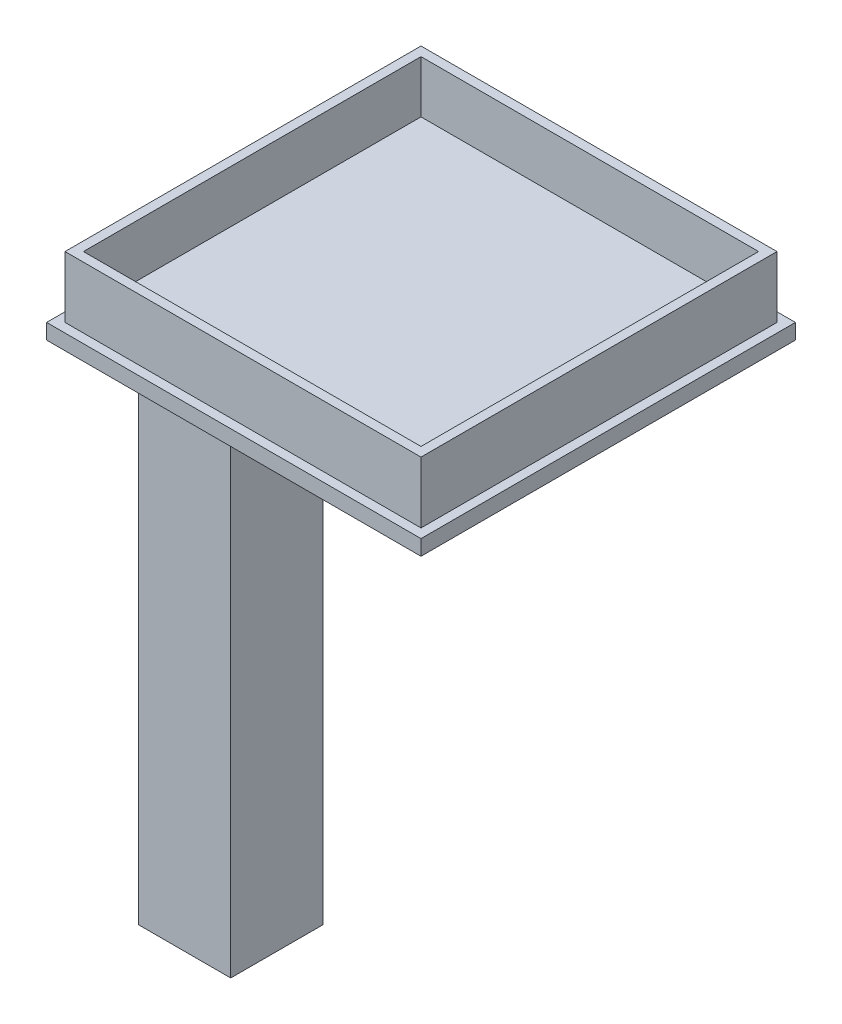
ISO-10303-21;
HEADER;
FILE_DESCRIPTION(('STEP AP214'),'2;1');
FILE_NAME('part.step','',(''),(''),'','','');
FILE_SCHEMA(('AUTOMOTIVE_DESIGN { 1 0 10303 214 1 1 1 1 }'));
ENDSEC;
DATA;
#1=APPLICATION_CONTEXT('core data for automotive mechanical design processes');
#2=APPLICATION_PROTOCOL_DEFINITION('international standard','automotive_design',2000,#1);
#3=PRODUCT_CONTEXT('',#1,'mechanical');
#4=PRODUCT('Part','Part','',(#3));
#5=PRODUCT_RELATED_PRODUCT_CATEGORY('part','',(#4));
#6=PRODUCT_DEFINITION_FORMATION('','',#4);
#7=PRODUCT_DEFINITION_CONTEXT('part definition',#1,'design');
#8=PRODUCT_DEFINITION('design','',#6,#7);
#9=PRODUCT_DEFINITION_SHAPE('','',#8);
#10=(LENGTH_UNIT() NAMED_UNIT(*) SI_UNIT(.MILLI.,.METRE.));
#11=(NAMED_UNIT(*) PLANE_ANGLE_UNIT() SI_UNIT($,.RADIAN.));
#12=(NAMED_UNIT(*) SI_UNIT($,.STERADIAN.) SOLID_ANGLE_UNIT());
#13=UNCERTAINTY_MEASURE_WITH_UNIT(LENGTH_MEASURE(1.E-05),#10,'distance_accuracy_value','');
#14=(GEOMETRIC_REPRESENTATION_CONTEXT(3) GLOBAL_UNCERTAINTY_ASSIGNED_CONTEXT((#13)) GLOBAL_UNIT_ASSIGNED_CONTEXT((#10,
#11,#12)) REPRESENTATION_CONTEXT('',''));
#15=CARTESIAN_POINT('',(0.,0.,0.));
#16=DIRECTION('',(0.,0.,1.));
#17=DIRECTION('',(1.,0.,0.));
#18=AXIS2_PLACEMENT_3D('',#15,#16,#17);
#19=CARTESIAN_POINT('',(0.,-5.,0.));
#20=DIRECTION('',(0.,-1.,0.));
#21=DIRECTION('',(0.,0.,-1.));
#22=AXIS2_PLACEMENT_3D('',#19,#20,#21);
#23=PLANE('',#22);
#24=DIRECTION('',(-1.,0.,0.));
#25=VECTOR('',#24,1.);
#26=CARTESIAN_POINT('',(61.,-5.,61.));
#27=LINE('',#26,#25);
#28=CARTESIAN_POINT('',(61.,-5.,61.));
#29=VERTEX_POINT('',#28);
#30=CARTESIAN_POINT('',(-61.,-5.,61.));
#31=VERTEX_POINT('',#30);
#32=EDGE_CURVE('E240',#29,#31,#27,.T.);
#33=ORIENTED_EDGE('',*,*,#32,.T.);
#34=DIRECTION('',(0.,0.,-1.));
#35=VECTOR('',#34,1.);
#36=CARTESIAN_POINT('',(-61.,-5.,61.));
#37=LINE('',#36,#35);
#38=CARTESIAN_POINT('',(-61.,-5.,-61.));
#39=VERTEX_POINT('',#38);
#40=EDGE_CURVE('E243',#31,#39,#37,.T.);
#41=ORIENTED_EDGE('',*,*,#40,.T.);
#42=DIRECTION('',(1.,0.,0.));
#43=VECTOR('',#42,1.);
#44=CARTESIAN_POINT('',(-61.,-5.,-61.));
#45=LINE('',#44,#43);
#46=CARTESIAN_POINT('',(61.,-5.,-61.));
#47=VERTEX_POINT('',#46);
#48=EDGE_CURVE('E246',#39,#47,#45,.T.);
#49=ORIENTED_EDGE('',*,*,#48,.T.);
#50=DIRECTION('',(0.,0.,1.));
#51=VECTOR('',#50,1.);
#52=CARTESIAN_POINT('',(61.,-5.,-61.));
#53=LINE('',#52,#51);
#54=EDGE_CURVE('E248',#47,#29,#53,.T.);
#55=ORIENTED_EDGE('',*,*,#54,.T.);
#56=EDGE_LOOP('',(#33,#41,#49,#55));
#57=FACE_BOUND('',#56,.T.);
#58=DIRECTION('',(1.,0.,0.));
#59=VECTOR('',#58,1.);
#60=CARTESIAN_POINT('',(-46.,-5.,16.));
#61=LINE('',#60,#59);
#62=CARTESIAN_POINT('',(-46.,-5.,16.));
#63=VERTEX_POINT('',#62);
#64=CARTESIAN_POINT('',(-16.,-5.,16.));
#65=VERTEX_POINT('',#64);
#66=EDGE_CURVE('E226',#63,#65,#61,.T.);
#67=ORIENTED_EDGE('',*,*,#66,.F.);
#68=DIRECTION('',(0.,0.,-1.));
#69=VECTOR('',#68,1.);
#70=CARTESIAN_POINT('',(-46.,-5.,46.));
#71=LINE('',#70,#69);
#72=CARTESIAN_POINT('',(-46.,-5.,46.));
#73=VERTEX_POINT('',#72);
#74=EDGE_CURVE('E191',#73,#63,#71,.T.);
#75=ORIENTED_EDGE('',*,*,#74,.F.);
#76=DIRECTION('',(-1.,0.,0.));
#77=VECTOR('',#76,1.);
#78=CARTESIAN_POINT('',(-46.,-5.,46.));
#79=LINE('',#78,#77);
#80=CARTESIAN_POINT('',(-16.,-5.,46.));
#81=VERTEX_POINT('',#80);
#82=EDGE_CURVE('E217',#81,#73,#79,.T.);
#83=ORIENTED_EDGE('',*,*,#82,.F.);
#84=DIRECTION('',(0.,0.,1.));
#85=VECTOR('',#84,1.);
#86=CARTESIAN_POINT('',(-16.,-5.,46.));
#87=LINE('',#86,#85);
#88=EDGE_CURVE('E228',#65,#81,#87,.T.);
#89=ORIENTED_EDGE('',*,*,#88,.F.);
#90=EDGE_LOOP('',(#67,#75,#83,#89));
#91=FACE_BOUND('',#90,.T.);
#92=ADVANCED_FACE('F35',(#57,#91),#23,.T.);
#93=CARTESIAN_POINT('',(-58.,20.,-58.));
#94=DIRECTION('',(1.,0.,0.));
#95=DIRECTION('',(0.,0.,-1.));
#96=AXIS2_PLACEMENT_3D('',#93,#94,#95);
#97=PLANE('',#96);
#98=DIRECTION('',(0.,0.,1.));
#99=VECTOR('',#98,1.);
#100=CARTESIAN_POINT('',(-58.,0.,-58.));
#101=LINE('',#100,#99);
#102=CARTESIAN_POINT('',(-58.,0.,-58.));
#103=VERTEX_POINT('',#102);
#104=CARTESIAN_POINT('',(-58.,0.,58.));
#105=VERTEX_POINT('',#104);
#106=EDGE_CURVE('E276',#103,#105,#101,.T.);
#107=ORIENTED_EDGE('',*,*,#106,.T.);
#108=DIRECTION('',(0.,-1.,0.));
#109=VECTOR('',#108,1.);
#110=CARTESIAN_POINT('',(-58.,20.,58.));
#111=LINE('',#110,#109);
#112=CARTESIAN_POINT('',(-58.,20.,58.));
#113=VERTEX_POINT('',#112);
#114=EDGE_CURVE('E11',#113,#105,#111,.T.);
#115=ORIENTED_EDGE('',*,*,#114,.F.);
#116=DIRECTION('',(0.,0.,1.));
#117=VECTOR('',#116,1.);
#118=CARTESIAN_POINT('',(-58.,20.,-58.));
#119=LINE('',#118,#117);
#120=CARTESIAN_POINT('',(-58.,20.,-58.));
#121=VERTEX_POINT('',#120);
#122=EDGE_CURVE('E300',#121,#113,#119,.T.);
#123=ORIENTED_EDGE('',*,*,#122,.F.);
#124=DIRECTION('',(0.,-1.,0.));
#125=VECTOR('',#124,1.);
#126=CARTESIAN_POINT('',(-58.,20.,-58.));
#127=LINE('',#126,#125);
#128=EDGE_CURVE('E310',#121,#103,#127,.T.);
#129=ORIENTED_EDGE('',*,*,#128,.T.);
#130=EDGE_LOOP('',(#107,#115,#123,#129));
#131=FACE_BOUND('',#130,.T.);
#132=ADVANCED_FACE('F37',(#131),#97,.F.);
#133=CARTESIAN_POINT('',(-58.,20.,58.));
#134=DIRECTION('',(0.,0.,-1.));
#135=DIRECTION('',(-1.,0.,0.));
#136=AXIS2_PLACEMENT_3D('',#133,#134,#135);
#137=PLANE('',#136);
#138=DIRECTION('',(1.,0.,0.));
#139=VECTOR('',#138,1.);
#140=CARTESIAN_POINT('',(-58.,0.,58.));
#141=LINE('',#140,#139);
#142=CARTESIAN_POINT('',(58.,0.,58.));
#143=VERTEX_POINT('',#142);
#144=EDGE_CURVE('E313',#105,#143,#141,.T.);
#145=ORIENTED_EDGE('',*,*,#144,.T.);
#146=DIRECTION('',(0.,-1.,0.));
#147=VECTOR('',#146,1.);
#148=CARTESIAN_POINT('',(58.,20.,58.));
#149=LINE('',#148,#147);
#150=CARTESIAN_POINT('',(58.,20.,58.));
#151=VERTEX_POINT('',#150);
#152=EDGE_CURVE('E43',#151,#143,#149,.T.);
#153=ORIENTED_EDGE('',*,*,#152,.F.);
#154=DIRECTION('',(1.,0.,0.));
#155=VECTOR('',#154,1.);
#156=CARTESIAN_POINT('',(-58.,20.,58.));
#157=LINE('',#156,#155);
#158=EDGE_CURVE('E303',#113,#151,#157,.T.);
#159=ORIENTED_EDGE('',*,*,#158,.F.);
#160=ORIENTED_EDGE('',*,*,#114,.T.);
#161=EDGE_LOOP('',(#145,#153,#159,#160));
#162=FACE_BOUND('',#161,.T.);
#163=ADVANCED_FACE('F332',(#162),#137,.F.);
#164=CARTESIAN_POINT('',(58.,20.,-58.));
#165=DIRECTION('',(-1.,0.,0.));
#166=DIRECTION('',(0.,0.,1.));
#167=AXIS2_PLACEMENT_3D('',#164,#165,#166);
#168=PLANE('',#167);
#169=DIRECTION('',(0.,0.,-1.));
#170=VECTOR('',#169,1.);
#171=CARTESIAN_POINT('',(58.,0.,-58.));
#172=LINE('',#171,#170);
#173=CARTESIAN_POINT('',(58.,0.,-58.));
#174=VERTEX_POINT('',#173);
#175=EDGE_CURVE('E316',#143,#174,#172,.T.);
#176=ORIENTED_EDGE('',*,*,#175,.T.);
#177=DIRECTION('',(0.,-1.,0.));
#178=VECTOR('',#177,1.);
#179=CARTESIAN_POINT('',(58.,20.,-58.));
#180=LINE('',#179,#178);
#181=CARTESIAN_POINT('',(58.,20.,-58.));
#182=VERTEX_POINT('',#181);
#183=EDGE_CURVE('E323',#182,#174,#180,.T.);
#184=ORIENTED_EDGE('',*,*,#183,.F.);
#185=DIRECTION('',(0.,0.,-1.));
#186=VECTOR('',#185,1.);
#187=CARTESIAN_POINT('',(58.,20.,-58.));
#188=LINE('',#187,#186);
#189=EDGE_CURVE('E306',#151,#182,#188,.T.);
#190=ORIENTED_EDGE('',*,*,#189,.F.);
#191=ORIENTED_EDGE('',*,*,#152,.T.);
#192=EDGE_LOOP('',(#176,#184,#190,#191));
#193=FACE_BOUND('',#192,.T.);
#194=ADVANCED_FACE('F329',(#193),#168,.F.);
#195=CARTESIAN_POINT('',(-58.,20.,-58.));
#196=DIRECTION('',(0.,0.,1.));
#197=DIRECTION('',(1.,0.,0.));
#198=AXIS2_PLACEMENT_3D('',#195,#196,#197);
#199=PLANE('',#198);
#200=DIRECTION('',(-1.,0.,0.));
#201=VECTOR('',#200,1.);
#202=CARTESIAN_POINT('',(-58.,0.,-58.));
#203=LINE('',#202,#201);
#204=EDGE_CURVE('E304',#174,#103,#203,.T.);
#205=ORIENTED_EDGE('',*,*,#204,.T.);
#206=ORIENTED_EDGE('',*,*,#128,.F.);
#207=DIRECTION('',(-1.,0.,0.));
#208=VECTOR('',#207,1.);
#209=CARTESIAN_POINT('',(-58.,20.,-58.));
#210=LINE('',#209,#208);
#211=EDGE_CURVE('E308',#182,#121,#210,.T.);
#212=ORIENTED_EDGE('',*,*,#211,.F.);
#213=ORIENTED_EDGE('',*,*,#183,.T.);
#214=EDGE_LOOP('',(#205,#206,#212,#213));
#215=FACE_BOUND('',#214,.T.);
#216=ADVANCED_FACE('F339',(#215),#199,.F.);
#217=CARTESIAN_POINT('',(0.,20.,0.));
#218=DIRECTION('',(0.,1.,0.));
#219=DIRECTION('',(0.,0.,1.));
#220=AXIS2_PLACEMENT_3D('',#217,#218,#219);
#221=PLANE('',#220);
#222=DIRECTION('',(0.,0.,1.));
#223=VECTOR('',#222,1.);
#224=CARTESIAN_POINT('',(-55.,20.,-58.));
#225=LINE('',#224,#223);
#226=CARTESIAN_POINT('',(-55.,20.,-55.));
#227=VERTEX_POINT('',#226);
#228=CARTESIAN_POINT('',(-55.,20.,55.));
#229=VERTEX_POINT('',#228);
#230=EDGE_CURVE('E292',#227,#229,#225,.T.);
#231=ORIENTED_EDGE('',*,*,#230,.F.);
#232=DIRECTION('',(-1.,0.,0.));
#233=VECTOR('',#232,1.);
#234=CARTESIAN_POINT('',(-58.,20.,-55.));
#235=LINE('',#234,#233);
#236=CARTESIAN_POINT('',(55.,20.,-55.));
#237=VERTEX_POINT('',#236);
#238=EDGE_CURVE('E282',#237,#227,#235,.T.);
#239=ORIENTED_EDGE('',*,*,#238,.F.);
#240=DIRECTION('',(0.,0.,-1.));
#241=VECTOR('',#240,1.);
#242=CARTESIAN_POINT('',(55.,20.,-58.));
#243=LINE('',#242,#241);
#244=CARTESIAN_POINT('',(55.,20.,55.));
#245=VERTEX_POINT('',#244);
#246=EDGE_CURVE('E296',#245,#237,#243,.T.);
#247=ORIENTED_EDGE('',*,*,#246,.F.);
#248=DIRECTION('',(1.,0.,0.));
#249=VECTOR('',#248,1.);
#250=CARTESIAN_POINT('',(-58.,20.,55.));
#251=LINE('',#250,#249);
#252=EDGE_CURVE('E294',#229,#245,#251,.T.);
#253=ORIENTED_EDGE('',*,*,#252,.F.);
#254=EDGE_LOOP('',(#231,#239,#247,#253));
#255=FACE_BOUND('',#254,.T.);
#256=ORIENTED_EDGE('',*,*,#122,.T.);
#257=ORIENTED_EDGE('',*,*,#158,.T.);
#258=ORIENTED_EDGE('',*,*,#189,.T.);
#259=ORIENTED_EDGE('',*,*,#211,.T.);
#260=EDGE_LOOP('',(#256,#257,#258,#259));
#261=FACE_BOUND('',#260,.T.);
#262=ADVANCED_FACE('F344',(#255,#261),#221,.T.);
#263=CARTESIAN_POINT('',(-55.,20.,-58.));
#264=DIRECTION('',(1.,0.,0.));
#265=DIRECTION('',(0.,0.,-1.));
#266=AXIS2_PLACEMENT_3D('',#263,#264,#265);
#267=PLANE('',#266);
#268=DIRECTION('',(0.,0.,1.));
#269=VECTOR('',#268,1.);
#270=CARTESIAN_POINT('',(-55.,3.,-58.));
#271=LINE('',#270,#269);
#272=CARTESIAN_POINT('',(-55.,3.,-55.));
#273=VERTEX_POINT('',#272);
#274=CARTESIAN_POINT('',(-55.,3.,55.));
#275=VERTEX_POINT('',#274);
#276=EDGE_CURVE('E269',#273,#275,#271,.T.);
#277=ORIENTED_EDGE('',*,*,#276,.F.);
#278=DIRECTION('',(0.,-1.,0.));
#279=VECTOR('',#278,1.);
#280=CARTESIAN_POINT('',(-55.,20.,-55.));
#281=LINE('',#280,#279);
#282=EDGE_CURVE('E278',#227,#273,#281,.T.);
#283=ORIENTED_EDGE('',*,*,#282,.F.);
#284=ORIENTED_EDGE('',*,*,#230,.T.);
#285=DIRECTION('',(0.,-1.,0.));
#286=VECTOR('',#285,1.);
#287=CARTESIAN_POINT('',(-55.,20.,55.));
#288=LINE('',#287,#286);
#289=EDGE_CURVE('E273',#229,#275,#288,.T.);
#290=ORIENTED_EDGE('',*,*,#289,.T.);
#291=EDGE_LOOP('',(#277,#283,#284,#290));
#292=FACE_BOUND('',#291,.T.);
#293=ADVANCED_FACE('F346',(#292),#267,.T.);
#294=CARTESIAN_POINT('',(-58.,20.,55.));
#295=DIRECTION('',(0.,0.,-1.));
#296=DIRECTION('',(-1.,0.,0.));
#297=AXIS2_PLACEMENT_3D('',#294,#295,#296);
#298=PLANE('',#297);
#299=DIRECTION('',(1.,0.,0.));
#300=VECTOR('',#299,1.);
#301=CARTESIAN_POINT('',(-58.,3.,55.));
#302=LINE('',#301,#300);
#303=CARTESIAN_POINT('',(55.,3.,55.));
#304=VERTEX_POINT('',#303);
#305=EDGE_CURVE('E272',#275,#304,#302,.T.);
#306=ORIENTED_EDGE('',*,*,#305,.F.);
#307=ORIENTED_EDGE('',*,*,#289,.F.);
#308=ORIENTED_EDGE('',*,*,#252,.T.);
#309=DIRECTION('',(0.,-1.,0.));
#310=VECTOR('',#309,1.);
#311=CARTESIAN_POINT('',(55.,20.,55.));
#312=LINE('',#311,#310);
#313=EDGE_CURVE('E277',#245,#304,#312,.T.);
#314=ORIENTED_EDGE('',*,*,#313,.T.);
#315=EDGE_LOOP('',(#306,#307,#308,#314));
#316=FACE_BOUND('',#315,.T.);
#317=ADVANCED_FACE('F353',(#316),#298,.T.);
#318=CARTESIAN_POINT('',(55.,20.,-58.));
#319=DIRECTION('',(-1.,0.,0.));
#320=DIRECTION('',(0.,0.,1.));
#321=AXIS2_PLACEMENT_3D('',#318,#319,#320);
#322=PLANE('',#321);
#323=DIRECTION('',(0.,0.,-1.));
#324=VECTOR('',#323,1.);
#325=CARTESIAN_POINT('',(55.,3.,-58.));
#326=LINE('',#325,#324);
#327=CARTESIAN_POINT('',(55.,3.,-55.));
#328=VERTEX_POINT('',#327);
#329=EDGE_CURVE('E284',#304,#328,#326,.T.);
#330=ORIENTED_EDGE('',*,*,#329,.F.);
#331=ORIENTED_EDGE('',*,*,#313,.F.);
#332=ORIENTED_EDGE('',*,*,#246,.T.);
#333=DIRECTION('',(0.,-1.,0.));
#334=VECTOR('',#333,1.);
#335=CARTESIAN_POINT('',(55.,20.,-55.));
#336=LINE('',#335,#334);
#337=EDGE_CURVE('E281',#237,#328,#336,.T.);
#338=ORIENTED_EDGE('',*,*,#337,.T.);
#339=EDGE_LOOP('',(#330,#331,#332,#338));
#340=FACE_BOUND('',#339,.T.);
#341=ADVANCED_FACE('F563',(#340),#322,.T.);
#342=CARTESIAN_POINT('',(-58.,20.,-55.));
#343=DIRECTION('',(0.,0.,1.));
#344=DIRECTION('',(1.,0.,0.));
#345=AXIS2_PLACEMENT_3D('',#342,#343,#344);
#346=PLANE('',#345);
#347=DIRECTION('',(-1.,0.,0.));
#348=VECTOR('',#347,1.);
#349=CARTESIAN_POINT('',(-58.,3.,-55.));
#350=LINE('',#349,#348);
#351=EDGE_CURVE('E288',#328,#273,#350,.T.);
#352=ORIENTED_EDGE('',*,*,#351,.F.);
#353=ORIENTED_EDGE('',*,*,#337,.F.);
#354=ORIENTED_EDGE('',*,*,#238,.T.);
#355=ORIENTED_EDGE('',*,*,#282,.T.);
#356=EDGE_LOOP('',(#352,#353,#354,#355));
#357=FACE_BOUND('',#356,.T.);
#358=ADVANCED_FACE('F554',(#357),#346,.T.);
#359=CARTESIAN_POINT('',(0.,3.,0.));
#360=DIRECTION('',(0.,1.,0.));
#361=DIRECTION('',(0.,0.,1.));
#362=AXIS2_PLACEMENT_3D('',#359,#360,#361);
#363=PLANE('',#362);
#364=ORIENTED_EDGE('',*,*,#276,.T.);
#365=ORIENTED_EDGE('',*,*,#305,.T.);
#366=ORIENTED_EDGE('',*,*,#329,.T.);
#367=ORIENTED_EDGE('',*,*,#351,.T.);
#368=EDGE_LOOP('',(#364,#365,#366,#367));
#369=FACE_BOUND('',#368,.T.);
#370=ADVANCED_FACE('F516',(#369),#363,.T.);
#371=CARTESIAN_POINT('',(61.,-5.,61.));
#372=DIRECTION('',(0.,0.,-1.));
#373=DIRECTION('',(-1.,0.,0.));
#374=AXIS2_PLACEMENT_3D('',#371,#372,#373);
#375=PLANE('',#374);
#376=DIRECTION('',(-1.,0.,0.));
#377=VECTOR('',#376,1.);
#378=CARTESIAN_POINT('',(61.,0.,61.));
#379=LINE('',#378,#377);
#380=CARTESIAN_POINT('',(61.,0.,61.));
#381=VERTEX_POINT('',#380);
#382=CARTESIAN_POINT('',(-61.,0.,61.));
#383=VERTEX_POINT('',#382);
#384=EDGE_CURVE('E239',#381,#383,#379,.T.);
#385=ORIENTED_EDGE('',*,*,#384,.T.);
#386=DIRECTION('',(0.,1.,0.));
#387=VECTOR('',#386,1.);
#388=CARTESIAN_POINT('',(-61.,-5.,61.));
#389=LINE('',#388,#387);
#390=EDGE_CURVE('E266',#31,#383,#389,.T.);
#391=ORIENTED_EDGE('',*,*,#390,.F.);
#392=ORIENTED_EDGE('',*,*,#32,.F.);
#393=DIRECTION('',(0.,1.,0.));
#394=VECTOR('',#393,1.);
#395=CARTESIAN_POINT('',(61.,-5.,61.));
#396=LINE('',#395,#394);
#397=EDGE_CURVE('E250',#29,#381,#396,.T.);
#398=ORIENTED_EDGE('',*,*,#397,.T.);
#399=EDGE_LOOP('',(#385,#391,#392,#398));
#400=FACE_BOUND('',#399,.T.);
#401=ADVANCED_FACE('F506',(#400),#375,.F.);
#402=CARTESIAN_POINT('',(-61.,-5.,61.));
#403=DIRECTION('',(1.,0.,0.));
#404=DIRECTION('',(0.,0.,-1.));
#405=AXIS2_PLACEMENT_3D('',#402,#403,#404);
#406=PLANE('',#405);
#407=DIRECTION('',(0.,0.,-1.));
#408=VECTOR('',#407,1.);
#409=CARTESIAN_POINT('',(-61.,0.,61.));
#410=LINE('',#409,#408);
#411=CARTESIAN_POINT('',(-61.,0.,-61.));
#412=VERTEX_POINT('',#411);
#413=EDGE_CURVE('E253',#383,#412,#410,.T.);
#414=ORIENTED_EDGE('',*,*,#413,.T.);
#415=DIRECTION('',(0.,1.,0.));
#416=VECTOR('',#415,1.);
#417=CARTESIAN_POINT('',(-61.,-5.,-61.));
#418=LINE('',#417,#416);
#419=EDGE_CURVE('E263',#39,#412,#418,.T.);
#420=ORIENTED_EDGE('',*,*,#419,.F.);
#421=ORIENTED_EDGE('',*,*,#40,.F.);
#422=ORIENTED_EDGE('',*,*,#390,.T.);
#423=EDGE_LOOP('',(#414,#420,#421,#422));
#424=FACE_BOUND('',#423,.T.);
#425=ADVANCED_FACE('F496',(#424),#406,.F.);
#426=CARTESIAN_POINT('',(-61.,-5.,-61.));
#427=DIRECTION('',(0.,0.,1.));
#428=DIRECTION('',(1.,0.,0.));
#429=AXIS2_PLACEMENT_3D('',#426,#427,#428);
#430=PLANE('',#429);
#431=DIRECTION('',(1.,0.,0.));
#432=VECTOR('',#431,1.);
#433=CARTESIAN_POINT('',(-61.,0.,-61.));
#434=LINE('',#433,#432);
#435=CARTESIAN_POINT('',(61.,0.,-61.));
#436=VERTEX_POINT('',#435);
#437=EDGE_CURVE('E255',#412,#436,#434,.T.);
#438=ORIENTED_EDGE('',*,*,#437,.T.);
#439=DIRECTION('',(0.,1.,0.));
#440=VECTOR('',#439,1.);
#441=CARTESIAN_POINT('',(61.,-5.,-61.));
#442=LINE('',#441,#440);
#443=EDGE_CURVE('E260',#47,#436,#442,.T.);
#444=ORIENTED_EDGE('',*,*,#443,.F.);
#445=ORIENTED_EDGE('',*,*,#48,.F.);
#446=ORIENTED_EDGE('',*,*,#419,.T.);
#447=EDGE_LOOP('',(#438,#444,#445,#446));
#448=FACE_BOUND('',#447,.T.);
#449=ADVANCED_FACE('F489',(#448),#430,.F.);
#450=CARTESIAN_POINT('',(61.,-5.,-61.));
#451=DIRECTION('',(-1.,0.,0.));
#452=DIRECTION('',(0.,0.,1.));
#453=AXIS2_PLACEMENT_3D('',#450,#451,#452);
#454=PLANE('',#453);
#455=DIRECTION('',(0.,0.,1.));
#456=VECTOR('',#455,1.);
#457=CARTESIAN_POINT('',(61.,0.,-61.));
#458=LINE('',#457,#456);
#459=EDGE_CURVE('E244',#436,#381,#458,.T.);
#460=ORIENTED_EDGE('',*,*,#459,.T.);
#461=ORIENTED_EDGE('',*,*,#397,.F.);
#462=ORIENTED_EDGE('',*,*,#54,.F.);
#463=ORIENTED_EDGE('',*,*,#443,.T.);
#464=EDGE_LOOP('',(#460,#461,#462,#463));
#465=FACE_BOUND('',#464,.T.);
#466=ADVANCED_FACE('F456',(#465),#454,.F.);
#467=CARTESIAN_POINT('',(0.,0.,0.));
#468=DIRECTION('',(0.,-1.,0.));
#469=DIRECTION('',(0.,0.,-1.));
#470=AXIS2_PLACEMENT_3D('',#467,#468,#469);
#471=PLANE('',#470);
#472=ORIENTED_EDGE('',*,*,#106,.F.);
#473=ORIENTED_EDGE('',*,*,#204,.F.);
#474=ORIENTED_EDGE('',*,*,#175,.F.);
#475=ORIENTED_EDGE('',*,*,#144,.F.);
#476=EDGE_LOOP('',(#472,#473,#474,#475));
#477=FACE_BOUND('',#476,.T.);
#478=ORIENTED_EDGE('',*,*,#384,.F.);
#479=ORIENTED_EDGE('',*,*,#459,.F.);
#480=ORIENTED_EDGE('',*,*,#437,.F.);
#481=ORIENTED_EDGE('',*,*,#413,.F.);
#482=EDGE_LOOP('',(#478,#479,#480,#481));
#483=FACE_BOUND('',#482,.T.);
#484=ADVANCED_FACE('F335',(#477,#483),#471,.F.);
#485=CARTESIAN_POINT('',(0.,-170.,0.));
#486=DIRECTION('',(0.,-1.,0.));
#487=DIRECTION('',(0.,0.,-1.));
#488=AXIS2_PLACEMENT_3D('',#485,#486,#487);
#489=PLANE('',#488);
#490=DIRECTION('',(0.,0.,-1.));
#491=VECTOR('',#490,1.);
#492=CARTESIAN_POINT('',(-46.,-170.,46.));
#493=LINE('',#492,#491);
#494=CARTESIAN_POINT('',(-46.,-170.,46.));
#495=VERTEX_POINT('',#494);
#496=CARTESIAN_POINT('',(-46.,-170.,16.));
#497=VERTEX_POINT('',#496);
#498=EDGE_CURVE('E213',#495,#497,#493,.T.);
#499=ORIENTED_EDGE('',*,*,#498,.T.);
#500=DIRECTION('',(1.,0.,0.));
#501=VECTOR('',#500,1.);
#502=CARTESIAN_POINT('',(-46.,-170.,16.));
#503=LINE('',#502,#501);
#504=CARTESIAN_POINT('',(-16.,-170.,16.));
#505=VERTEX_POINT('',#504);
#506=EDGE_CURVE('E216',#497,#505,#503,.T.);
#507=ORIENTED_EDGE('',*,*,#506,.T.);
#508=DIRECTION('',(0.,0.,1.));
#509=VECTOR('',#508,1.);
#510=CARTESIAN_POINT('',(-16.,-170.,46.));
#511=LINE('',#510,#509);
#512=CARTESIAN_POINT('',(-16.,-170.,46.));
#513=VERTEX_POINT('',#512);
#514=EDGE_CURVE('E219',#505,#513,#511,.T.);
#515=ORIENTED_EDGE('',*,*,#514,.T.);
#516=DIRECTION('',(-1.,0.,0.));
#517=VECTOR('',#516,1.);
#518=CARTESIAN_POINT('',(-46.,-170.,46.));
#519=LINE('',#518,#517);
#520=EDGE_CURVE('E221',#513,#495,#519,.T.);
#521=ORIENTED_EDGE('',*,*,#520,.T.);
#522=EDGE_LOOP('',(#499,#507,#515,#521));
#523=FACE_BOUND('',#522,.T.);
#524=DIRECTION('',(1.,0.,0.));
#525=VECTOR('',#524,1.);
#526=CARTESIAN_POINT('',(-44.,-170.,18.));
#527=LINE('',#526,#525);
#528=CARTESIAN_POINT('',(-44.,-170.,18.));
#529=VERTEX_POINT('',#528);
#530=CARTESIAN_POINT('',(-18.,-170.,18.));
#531=VERTEX_POINT('',#530);
#532=EDGE_CURVE('E183',#529,#531,#527,.T.);
#533=ORIENTED_EDGE('',*,*,#532,.F.);
#534=DIRECTION('',(0.,0.,-1.));
#535=VECTOR('',#534,1.);
#536=CARTESIAN_POINT('',(-44.,-170.,44.));
#537=LINE('',#536,#535);
#538=CARTESIAN_POINT('',(-44.,-170.,44.));
#539=VERTEX_POINT('',#538);
#540=EDGE_CURVE('E174',#539,#529,#537,.T.);
#541=ORIENTED_EDGE('',*,*,#540,.F.);
#542=DIRECTION('',(-1.,0.,0.));
#543=VECTOR('',#542,1.);
#544=CARTESIAN_POINT('',(-44.,-170.,44.));
#545=LINE('',#544,#543);
#546=CARTESIAN_POINT('',(-18.,-170.,44.));
#547=VERTEX_POINT('',#546);
#548=EDGE_CURVE('E199',#547,#539,#545,.T.);
#549=ORIENTED_EDGE('',*,*,#548,.F.);
#550=DIRECTION('',(0.,0.,1.));
#551=VECTOR('',#550,1.);
#552=CARTESIAN_POINT('',(-18.,-170.,44.));
#553=LINE('',#552,#551);
#554=EDGE_CURVE('E197',#531,#547,#553,.T.);
#555=ORIENTED_EDGE('',*,*,#554,.F.);
#556=EDGE_LOOP('',(#533,#541,#549,#555));
#557=FACE_BOUND('',#556,.T.);
#558=ADVANCED_FACE('F195',(#523,#557),#489,.T.);
#559=CARTESIAN_POINT('',(-46.,-170.,46.));
#560=DIRECTION('',(1.,0.,0.));
#561=DIRECTION('',(0.,0.,-1.));
#562=AXIS2_PLACEMENT_3D('',#559,#560,#561);
#563=PLANE('',#562);
#564=ORIENTED_EDGE('',*,*,#74,.T.);
#565=DIRECTION('',(0.,1.,0.));
#566=VECTOR('',#565,1.);
#567=CARTESIAN_POINT('',(-46.,-170.,16.));
#568=LINE('',#567,#566);
#569=EDGE_CURVE('E237',#497,#63,#568,.T.);
#570=ORIENTED_EDGE('',*,*,#569,.F.);
#571=ORIENTED_EDGE('',*,*,#498,.F.);
#572=DIRECTION('',(0.,1.,0.));
#573=VECTOR('',#572,1.);
#574=CARTESIAN_POINT('',(-46.,-170.,46.));
#575=LINE('',#574,#573);
#576=EDGE_CURVE('E223',#495,#73,#575,.T.);
#577=ORIENTED_EDGE('',*,*,#576,.T.);
#578=EDGE_LOOP('',(#564,#570,#571,#577));
#579=FACE_BOUND('',#578,.T.);
#580=ADVANCED_FACE('F391',(#579),#563,.F.);
#581=CARTESIAN_POINT('',(-46.,-170.,16.));
#582=DIRECTION('',(0.,0.,1.));
#583=DIRECTION('',(1.,0.,0.));
#584=AXIS2_PLACEMENT_3D('',#581,#582,#583);
#585=PLANE('',#584);
#586=ORIENTED_EDGE('',*,*,#66,.T.);
#587=DIRECTION('',(0.,1.,0.));
#588=VECTOR('',#587,1.);
#589=CARTESIAN_POINT('',(-16.,-170.,16.));
#590=LINE('',#589,#588);
#591=EDGE_CURVE('E234',#505,#65,#590,.T.);
#592=ORIENTED_EDGE('',*,*,#591,.F.);
#593=ORIENTED_EDGE('',*,*,#506,.F.);
#594=ORIENTED_EDGE('',*,*,#569,.T.);
#595=EDGE_LOOP('',(#586,#592,#593,#594));
#596=FACE_BOUND('',#595,.T.);
#597=ADVANCED_FACE('F398',(#596),#585,.F.);
#598=CARTESIAN_POINT('',(-16.,-170.,46.));
#599=DIRECTION('',(-1.,0.,0.));
#600=DIRECTION('',(0.,0.,1.));
#601=AXIS2_PLACEMENT_3D('',#598,#599,#600);
#602=PLANE('',#601);
#603=ORIENTED_EDGE('',*,*,#88,.T.);
#604=DIRECTION('',(0.,1.,0.));
#605=VECTOR('',#604,1.);
#606=CARTESIAN_POINT('',(-16.,-170.,46.));
#607=LINE('',#606,#605);
#608=EDGE_CURVE('E50',#513,#81,#607,.T.);
#609=ORIENTED_EDGE('',*,*,#608,.F.);
#610=ORIENTED_EDGE('',*,*,#514,.F.);
#611=ORIENTED_EDGE('',*,*,#591,.T.);
#612=EDGE_LOOP('',(#603,#609,#610,#611));
#613=FACE_BOUND('',#612,.T.);
#614=ADVANCED_FACE('F395',(#613),#602,.F.);
#615=CARTESIAN_POINT('',(-46.,-170.,46.));
#616=DIRECTION('',(0.,0.,-1.));
#617=DIRECTION('',(-1.,0.,0.));
#618=AXIS2_PLACEMENT_3D('',#615,#616,#617);
#619=PLANE('',#618);
#620=ORIENTED_EDGE('',*,*,#82,.T.);
#621=ORIENTED_EDGE('',*,*,#576,.F.);
#622=ORIENTED_EDGE('',*,*,#520,.F.);
#623=ORIENTED_EDGE('',*,*,#608,.T.);
#624=EDGE_LOOP('',(#620,#621,#622,#623));
#625=FACE_BOUND('',#624,.T.);
#626=ADVANCED_FACE('F388',(#625),#619,.F.);
#627=CARTESIAN_POINT('',(-44.,-170.,44.));
#628=DIRECTION('',(1.,0.,0.));
#629=DIRECTION('',(0.,0.,-1.));
#630=AXIS2_PLACEMENT_3D('',#627,#628,#629);
#631=PLANE('',#630);
#632=DIRECTION('',(0.,0.,-1.));
#633=VECTOR('',#632,1.);
#634=CARTESIAN_POINT('',(-44.,-5.,44.));
#635=LINE('',#634,#633);
#636=CARTESIAN_POINT('',(-44.,-5.,44.));
#637=VERTEX_POINT('',#636);
#638=CARTESIAN_POINT('',(-44.,-5.,18.));
#639=VERTEX_POINT('',#638);
#640=EDGE_CURVE('E58',#637,#639,#635,.T.);
#641=ORIENTED_EDGE('',*,*,#640,.F.);
#642=DIRECTION('',(0.,1.,0.));
#643=VECTOR('',#642,1.);
#644=CARTESIAN_POINT('',(-44.,-170.,44.));
#645=LINE('',#644,#643);
#646=EDGE_CURVE('E179',#539,#637,#645,.T.);
#647=ORIENTED_EDGE('',*,*,#646,.F.);
#648=ORIENTED_EDGE('',*,*,#540,.T.);
#649=DIRECTION('',(0.,1.,0.));
#650=VECTOR('',#649,1.);
#651=CARTESIAN_POINT('',(-44.,-170.,18.));
#652=LINE('',#651,#650);
#653=EDGE_CURVE('E177',#529,#639,#652,.T.);
#654=ORIENTED_EDGE('',*,*,#653,.T.);
#655=EDGE_LOOP('',(#641,#647,#648,#654));
#656=FACE_BOUND('',#655,.T.);
#657=ADVANCED_FACE('F176',(#656),#631,.T.);
#658=CARTESIAN_POINT('',(-44.,-170.,18.));
#659=DIRECTION('',(0.,0.,1.));
#660=DIRECTION('',(1.,0.,0.));
#661=AXIS2_PLACEMENT_3D('',#658,#659,#660);
#662=PLANE('',#661);
#663=DIRECTION('',(1.,0.,0.));
#664=VECTOR('',#663,1.);
#665=CARTESIAN_POINT('',(-44.,-5.,18.));
#666=LINE('',#665,#664);
#667=CARTESIAN_POINT('',(-18.,-5.,18.));
#668=VERTEX_POINT('',#667);
#669=EDGE_CURVE('E190',#639,#668,#666,.T.);
#670=ORIENTED_EDGE('',*,*,#669,.F.);
#671=ORIENTED_EDGE('',*,*,#653,.F.);
#672=ORIENTED_EDGE('',*,*,#532,.T.);
#673=DIRECTION('',(0.,1.,0.));
#674=VECTOR('',#673,1.);
#675=CARTESIAN_POINT('',(-18.,-170.,18.));
#676=LINE('',#675,#674);
#677=EDGE_CURVE('E192',#531,#668,#676,.T.);
#678=ORIENTED_EDGE('',*,*,#677,.T.);
#679=EDGE_LOOP('',(#670,#671,#672,#678));
#680=FACE_BOUND('',#679,.T.);
#681=ADVANCED_FACE('F187',(#680),#662,.T.);
#682=CARTESIAN_POINT('',(-18.,-170.,44.));
#683=DIRECTION('',(-1.,0.,0.));
#684=DIRECTION('',(0.,0.,1.));
#685=AXIS2_PLACEMENT_3D('',#682,#683,#684);
#686=PLANE('',#685);
#687=DIRECTION('',(0.,0.,1.));
#688=VECTOR('',#687,1.);
#689=CARTESIAN_POINT('',(-18.,-5.,44.));
#690=LINE('',#689,#688);
#691=CARTESIAN_POINT('',(-18.,-5.,44.));
#692=VERTEX_POINT('',#691);
#693=EDGE_CURVE('E205',#668,#692,#690,.T.);
#694=ORIENTED_EDGE('',*,*,#693,.F.);
#695=ORIENTED_EDGE('',*,*,#677,.F.);
#696=ORIENTED_EDGE('',*,*,#554,.T.);
#697=DIRECTION('',(0.,1.,0.));
#698=VECTOR('',#697,1.);
#699=CARTESIAN_POINT('',(-18.,-170.,44.));
#700=LINE('',#699,#698);
#701=EDGE_CURVE('E209',#547,#692,#700,.T.);
#702=ORIENTED_EDGE('',*,*,#701,.T.);
#703=EDGE_LOOP('',(#694,#695,#696,#702));
#704=FACE_BOUND('',#703,.T.);
#705=ADVANCED_FACE('F374',(#704),#686,.T.);
#706=CARTESIAN_POINT('',(-44.,-170.,44.));
#707=DIRECTION('',(0.,0.,-1.));
#708=DIRECTION('',(-1.,0.,0.));
#709=AXIS2_PLACEMENT_3D('',#706,#707,#708);
#710=PLANE('',#709);
#711=DIRECTION('',(-1.,0.,0.));
#712=VECTOR('',#711,1.);
#713=CARTESIAN_POINT('',(-44.,-5.,44.));
#714=LINE('',#713,#712);
#715=EDGE_CURVE('E184',#692,#637,#714,.T.);
#716=ORIENTED_EDGE('',*,*,#715,.F.);
#717=ORIENTED_EDGE('',*,*,#701,.F.);
#718=ORIENTED_EDGE('',*,*,#548,.T.);
#719=ORIENTED_EDGE('',*,*,#646,.T.);
#720=EDGE_LOOP('',(#716,#717,#718,#719));
#721=FACE_BOUND('',#720,.T.);
#722=ADVANCED_FACE('F370',(#721),#710,.T.);
#723=ORIENTED_EDGE('',*,*,#640,.T.);
#724=ORIENTED_EDGE('',*,*,#669,.T.);
#725=ORIENTED_EDGE('',*,*,#693,.T.);
#726=ORIENTED_EDGE('',*,*,#715,.T.);
#727=EDGE_LOOP('',(#723,#724,#725,#726));
#728=FACE_BOUND('',#727,.T.);
#729=ADVANCED_FACE('F362',(#728),#23,.T.);
#730=CLOSED_SHELL('',(#92,#132,#163,#194,#216,#262,#293,#317,#341,#358,#370,#401,#425,#449,#466,
#484,#558,#580,#597,#614,#626,#657,#681,#705,#722,#729));
#731=MANIFOLD_SOLID_BREP('B2',#730);
#732=ADVANCED_BREP_SHAPE_REPRESENTATION('',(#18,#731),#14);
#733=SHAPE_DEFINITION_REPRESENTATION(#9,#732);
ENDSEC;
END-ISO-10303-21;
